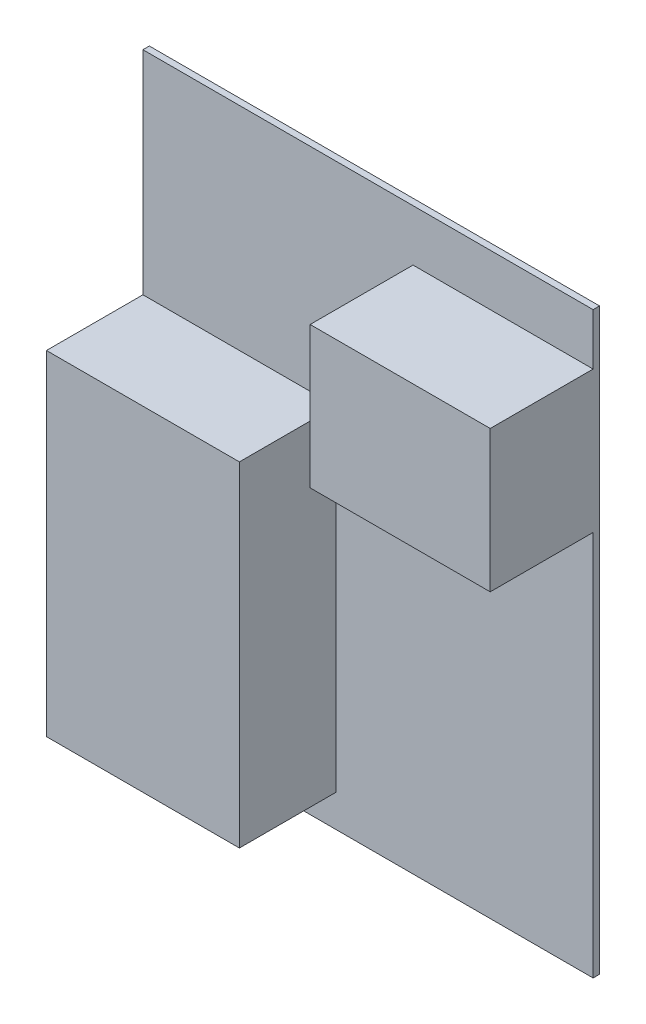
ISO-10303-21;
HEADER;
FILE_DESCRIPTION(('STEP AP214'),'2;1');
FILE_NAME('part.step','',(''),(''),'','','');
FILE_SCHEMA(('AUTOMOTIVE_DESIGN { 1 0 10303 214 1 1 1 1 }'));
ENDSEC;
DATA;
#1=APPLICATION_CONTEXT('core data for automotive mechanical design processes');
#2=APPLICATION_PROTOCOL_DEFINITION('international standard','automotive_design',2000,#1);
#3=PRODUCT_CONTEXT('',#1,'mechanical');
#4=PRODUCT('Part','Part','',(#3));
#5=PRODUCT_RELATED_PRODUCT_CATEGORY('part','',(#4));
#6=PRODUCT_DEFINITION_FORMATION('','',#4);
#7=PRODUCT_DEFINITION_CONTEXT('part definition',#1,'design');
#8=PRODUCT_DEFINITION('design','',#6,#7);
#9=PRODUCT_DEFINITION_SHAPE('','',#8);
#10=(LENGTH_UNIT() NAMED_UNIT(*) SI_UNIT(.MILLI.,.METRE.));
#11=(NAMED_UNIT(*) PLANE_ANGLE_UNIT() SI_UNIT($,.RADIAN.));
#12=(NAMED_UNIT(*) SI_UNIT($,.STERADIAN.) SOLID_ANGLE_UNIT());
#13=UNCERTAINTY_MEASURE_WITH_UNIT(LENGTH_MEASURE(1.E-05),#10,'distance_accuracy_value','');
#14=(GEOMETRIC_REPRESENTATION_CONTEXT(3) GLOBAL_UNCERTAINTY_ASSIGNED_CONTEXT((#13)) GLOBAL_UNIT_ASSIGNED_CONTEXT((#10,
#11,#12)) REPRESENTATION_CONTEXT('',''));
#15=CARTESIAN_POINT('',(0.,0.,0.));
#16=DIRECTION('',(0.,0.,1.));
#17=DIRECTION('',(1.,0.,0.));
#18=AXIS2_PLACEMENT_3D('',#15,#16,#17);
#19=CARTESIAN_POINT('',(0.,0.,1.));
#20=DIRECTION('',(0.,0.,-1.));
#21=DIRECTION('',(-1.,0.,0.));
#22=AXIS2_PLACEMENT_3D('',#19,#20,#21);
#23=PLANE('',#22);
#24=DIRECTION('',(1.,0.,0.));
#25=VECTOR('',#24,1.);
#26=CARTESIAN_POINT('',(-35.,-40.,1.));
#27=LINE('',#26,#25);
#28=CARTESIAN_POINT('',(-35.,-40.,1.));
#29=VERTEX_POINT('',#28);
#30=CARTESIAN_POINT('',(-5.,-40.,1.));
#31=VERTEX_POINT('',#30);
#32=EDGE_CURVE('E268',#29,#31,#27,.T.);
#33=ORIENTED_EDGE('',*,*,#32,.F.);
#34=DIRECTION('',(0.,-1.,0.));
#35=VECTOR('',#34,1.);
#36=CARTESIAN_POINT('',(-35.,-45.,1.));
#37=LINE('',#36,#35);
#38=CARTESIAN_POINT('',(-35.,-45.,1.));
#39=VERTEX_POINT('',#38);
#40=EDGE_CURVE('E152',#29,#39,#37,.T.);
#41=ORIENTED_EDGE('',*,*,#40,.T.);
#42=DIRECTION('',(1.,0.,0.));
#43=VECTOR('',#42,1.);
#44=CARTESIAN_POINT('',(-35.,-45.,1.));
#45=LINE('',#44,#43);
#46=CARTESIAN_POINT('',(35.,-45.,1.));
#47=VERTEX_POINT('',#46);
#48=EDGE_CURVE('E212',#39,#47,#45,.T.);
#49=ORIENTED_EDGE('',*,*,#48,.T.);
#50=DIRECTION('',(0.,1.,0.));
#51=VECTOR('',#50,1.);
#52=CARTESIAN_POINT('',(35.,-45.,1.));
#53=LINE('',#52,#51);
#54=CARTESIAN_POINT('',(35.,15.,1.));
#55=VERTEX_POINT('',#54);
#56=EDGE_CURVE('E202',#47,#55,#53,.T.);
#57=ORIENTED_EDGE('',*,*,#56,.T.);
#58=DIRECTION('',(1.,0.,0.));
#59=VECTOR('',#58,1.);
#60=CARTESIAN_POINT('',(35.,15.,1.));
#61=LINE('',#60,#59);
#62=CARTESIAN_POINT('',(7.00000000000002,15.,1.));
#63=VERTEX_POINT('',#62);
#64=EDGE_CURVE('E170',#63,#55,#61,.T.);
#65=ORIENTED_EDGE('',*,*,#64,.F.);
#66=DIRECTION('',(0.,-1.,0.));
#67=VECTOR('',#66,1.);
#68=CARTESIAN_POINT('',(7.00000000000001,37.,1.));
#69=LINE('',#68,#67);
#70=CARTESIAN_POINT('',(7.00000000000001,37.,1.));
#71=VERTEX_POINT('',#70);
#72=EDGE_CURVE('E159',#71,#63,#69,.T.);
#73=ORIENTED_EDGE('',*,*,#72,.F.);
#74=DIRECTION('',(-1.,0.,0.));
#75=VECTOR('',#74,1.);
#76=CARTESIAN_POINT('',(35.,37.,1.));
#77=LINE('',#76,#75);
#78=CARTESIAN_POINT('',(35.,37.,1.));
#79=VERTEX_POINT('',#78);
#80=EDGE_CURVE('E154',#79,#71,#77,.T.);
#81=ORIENTED_EDGE('',*,*,#80,.F.);
#82=CARTESIAN_POINT('',(35.,45.,1.));
#83=VERTEX_POINT('',#82);
#84=EDGE_CURVE('E206',#79,#83,#53,.T.);
#85=ORIENTED_EDGE('',*,*,#84,.T.);
#86=DIRECTION('',(-1.,0.,0.));
#87=VECTOR('',#86,1.);
#88=CARTESIAN_POINT('',(-35.,45.,1.));
#89=LINE('',#88,#87);
#90=CARTESIAN_POINT('',(-35.,45.,1.));
#91=VERTEX_POINT('',#90);
#92=EDGE_CURVE('E205',#83,#91,#89,.T.);
#93=ORIENTED_EDGE('',*,*,#92,.T.);
#94=CARTESIAN_POINT('',(-35.,12.,1.));
#95=VERTEX_POINT('',#94);
#96=EDGE_CURVE('E209',#91,#95,#37,.T.);
#97=ORIENTED_EDGE('',*,*,#96,.T.);
#98=DIRECTION('',(-1.,0.,0.));
#99=VECTOR('',#98,1.);
#100=CARTESIAN_POINT('',(-35.,12.,1.));
#101=LINE('',#100,#99);
#102=CARTESIAN_POINT('',(-5.,12.,1.));
#103=VERTEX_POINT('',#102);
#104=EDGE_CURVE('E60',#103,#95,#101,.T.);
#105=ORIENTED_EDGE('',*,*,#104,.F.);
#106=DIRECTION('',(0.,1.,0.));
#107=VECTOR('',#106,1.);
#108=CARTESIAN_POINT('',(-5.,-40.,1.));
#109=LINE('',#108,#107);
#110=EDGE_CURVE('E55',#31,#103,#109,.T.);
#111=ORIENTED_EDGE('',*,*,#110,.F.);
#112=EDGE_LOOP('',(#33,#41,#49,#57,#65,#73,#81,#85,#93,#97,#105,#111));
#113=FACE_BOUND('',#112,.T.);
#114=ADVANCED_FACE('F39',(#113),#23,.F.);
#115=CARTESIAN_POINT('',(35.,-45.,1.));
#116=DIRECTION('',(-1.,0.,0.));
#117=DIRECTION('',(0.,0.,1.));
#118=AXIS2_PLACEMENT_3D('',#115,#116,#117);
#119=PLANE('',#118);
#120=DIRECTION('',(0.,1.,0.));
#121=VECTOR('',#120,1.);
#122=CARTESIAN_POINT('',(35.,-45.,0.));
#123=LINE('',#122,#121);
#124=CARTESIAN_POINT('',(35.,-45.,0.));
#125=VERTEX_POINT('',#124);
#126=CARTESIAN_POINT('',(35.,45.,0.));
#127=VERTEX_POINT('',#126);
#128=EDGE_CURVE('E201',#125,#127,#123,.T.);
#129=ORIENTED_EDGE('',*,*,#128,.T.);
#130=DIRECTION('',(0.,0.,-1.));
#131=VECTOR('',#130,1.);
#132=CARTESIAN_POINT('',(35.,45.,1.));
#133=LINE('',#132,#131);
#134=EDGE_CURVE('E11',#83,#127,#133,.T.);
#135=ORIENTED_EDGE('',*,*,#134,.F.);
#136=ORIENTED_EDGE('',*,*,#84,.F.);
#137=DIRECTION('',(0.,0.,-1.));
#138=VECTOR('',#137,1.);
#139=CARTESIAN_POINT('',(35.,37.,17.));
#140=LINE('',#139,#138);
#141=CARTESIAN_POINT('',(35.,37.,17.));
#142=VERTEX_POINT('',#141);
#143=EDGE_CURVE('E197',#142,#79,#140,.T.);
#144=ORIENTED_EDGE('',*,*,#143,.F.);
#145=DIRECTION('',(0.,1.,0.));
#146=VECTOR('',#145,1.);
#147=CARTESIAN_POINT('',(35.,37.,17.));
#148=LINE('',#147,#146);
#149=CARTESIAN_POINT('',(35.,15.,17.));
#150=VERTEX_POINT('',#149);
#151=EDGE_CURVE('E165',#150,#142,#148,.T.);
#152=ORIENTED_EDGE('',*,*,#151,.F.);
#153=DIRECTION('',(0.,0.,-1.));
#154=VECTOR('',#153,1.);
#155=CARTESIAN_POINT('',(35.,15.,17.));
#156=LINE('',#155,#154);
#157=EDGE_CURVE('E178',#150,#55,#156,.T.);
#158=ORIENTED_EDGE('',*,*,#157,.T.);
#159=ORIENTED_EDGE('',*,*,#56,.F.);
#160=DIRECTION('',(0.,0.,-1.));
#161=VECTOR('',#160,1.);
#162=CARTESIAN_POINT('',(35.,-45.,1.));
#163=LINE('',#162,#161);
#164=EDGE_CURVE('E215',#47,#125,#163,.T.);
#165=ORIENTED_EDGE('',*,*,#164,.T.);
#166=EDGE_LOOP('',(#129,#135,#136,#144,#152,#158,#159,#165));
#167=FACE_BOUND('',#166,.T.);
#168=ADVANCED_FACE('F41',(#167),#119,.F.);
#169=CARTESIAN_POINT('',(-35.,45.,1.));
#170=DIRECTION('',(0.,-1.,0.));
#171=DIRECTION('',(0.,0.,-1.));
#172=AXIS2_PLACEMENT_3D('',#169,#170,#171);
#173=PLANE('',#172);
#174=DIRECTION('',(-1.,0.,0.));
#175=VECTOR('',#174,1.);
#176=CARTESIAN_POINT('',(-35.,45.,0.));
#177=LINE('',#176,#175);
#178=CARTESIAN_POINT('',(-35.,45.,0.));
#179=VERTEX_POINT('',#178);
#180=EDGE_CURVE('E219',#127,#179,#177,.T.);
#181=ORIENTED_EDGE('',*,*,#180,.T.);
#182=DIRECTION('',(0.,0.,-1.));
#183=VECTOR('',#182,1.);
#184=CARTESIAN_POINT('',(-35.,45.,1.));
#185=LINE('',#184,#183);
#186=EDGE_CURVE('E48',#91,#179,#185,.T.);
#187=ORIENTED_EDGE('',*,*,#186,.F.);
#188=ORIENTED_EDGE('',*,*,#92,.F.);
#189=ORIENTED_EDGE('',*,*,#134,.T.);
#190=EDGE_LOOP('',(#181,#187,#188,#189));
#191=FACE_BOUND('',#190,.T.);
#192=ADVANCED_FACE('F303',(#191),#173,.F.);
#193=CARTESIAN_POINT('',(-35.,-45.,1.));
#194=DIRECTION('',(1.,0.,0.));
#195=DIRECTION('',(0.,0.,-1.));
#196=AXIS2_PLACEMENT_3D('',#193,#194,#195);
#197=PLANE('',#196);
#198=DIRECTION('',(0.,-1.,0.));
#199=VECTOR('',#198,1.);
#200=CARTESIAN_POINT('',(-35.,-45.,0.));
#201=LINE('',#200,#199);
#202=CARTESIAN_POINT('',(-35.,-45.,0.));
#203=VERTEX_POINT('',#202);
#204=EDGE_CURVE('E222',#179,#203,#201,.T.);
#205=ORIENTED_EDGE('',*,*,#204,.T.);
#206=DIRECTION('',(0.,0.,-1.));
#207=VECTOR('',#206,1.);
#208=CARTESIAN_POINT('',(-35.,-45.,1.));
#209=LINE('',#208,#207);
#210=EDGE_CURVE('E231',#39,#203,#209,.T.);
#211=ORIENTED_EDGE('',*,*,#210,.F.);
#212=ORIENTED_EDGE('',*,*,#40,.F.);
#213=DIRECTION('',(0.,0.,-1.));
#214=VECTOR('',#213,1.);
#215=CARTESIAN_POINT('',(-35.,-40.,16.));
#216=LINE('',#215,#214);
#217=CARTESIAN_POINT('',(-35.,-40.,16.));
#218=VERTEX_POINT('',#217);
#219=EDGE_CURVE('E132',#218,#29,#216,.T.);
#220=ORIENTED_EDGE('',*,*,#219,.F.);
#221=DIRECTION('',(0.,-1.,0.));
#222=VECTOR('',#221,1.);
#223=CARTESIAN_POINT('',(-35.,-40.,16.));
#224=LINE('',#223,#222);
#225=CARTESIAN_POINT('',(-35.,12.,16.));
#226=VERTEX_POINT('',#225);
#227=EDGE_CURVE('E139',#226,#218,#224,.T.);
#228=ORIENTED_EDGE('',*,*,#227,.F.);
#229=DIRECTION('',(0.,0.,-1.));
#230=VECTOR('',#229,1.);
#231=CARTESIAN_POINT('',(-35.,12.,16.));
#232=LINE('',#231,#230);
#233=EDGE_CURVE('E278',#226,#95,#232,.T.);
#234=ORIENTED_EDGE('',*,*,#233,.T.);
#235=ORIENTED_EDGE('',*,*,#96,.F.);
#236=ORIENTED_EDGE('',*,*,#186,.T.);
#237=EDGE_LOOP('',(#205,#211,#212,#220,#228,#234,#235,#236));
#238=FACE_BOUND('',#237,.T.);
#239=ADVANCED_FACE('F150',(#238),#197,.F.);
#240=CARTESIAN_POINT('',(-35.,-45.,1.));
#241=DIRECTION('',(0.,1.,0.));
#242=DIRECTION('',(0.,0.,1.));
#243=AXIS2_PLACEMENT_3D('',#240,#241,#242);
#244=PLANE('',#243);
#245=DIRECTION('',(1.,0.,0.));
#246=VECTOR('',#245,1.);
#247=CARTESIAN_POINT('',(-35.,-45.,0.));
#248=LINE('',#247,#246);
#249=EDGE_CURVE('E225',#203,#125,#248,.T.);
#250=ORIENTED_EDGE('',*,*,#249,.T.);
#251=ORIENTED_EDGE('',*,*,#164,.F.);
#252=ORIENTED_EDGE('',*,*,#48,.F.);
#253=ORIENTED_EDGE('',*,*,#210,.T.);
#254=EDGE_LOOP('',(#250,#251,#252,#253));
#255=FACE_BOUND('',#254,.T.);
#256=ADVANCED_FACE('F247',(#255),#244,.F.);
#257=CARTESIAN_POINT('',(0.,0.,0.));
#258=DIRECTION('',(0.,0.,-1.));
#259=DIRECTION('',(-1.,0.,0.));
#260=AXIS2_PLACEMENT_3D('',#257,#258,#259);
#261=PLANE('',#260);
#262=ORIENTED_EDGE('',*,*,#128,.F.);
#263=ORIENTED_EDGE('',*,*,#249,.F.);
#264=ORIENTED_EDGE('',*,*,#204,.F.);
#265=ORIENTED_EDGE('',*,*,#180,.F.);
#266=EDGE_LOOP('',(#262,#263,#264,#265));
#267=FACE_BOUND('',#266,.T.);
#268=ADVANCED_FACE('F244',(#267),#261,.T.);
#269=CARTESIAN_POINT('',(35.,37.,17.));
#270=DIRECTION('',(0.,-1.,0.));
#271=DIRECTION('',(1.,0.,0.));
#272=AXIS2_PLACEMENT_3D('',#269,#270,#271);
#273=PLANE('',#272);
#274=ORIENTED_EDGE('',*,*,#80,.T.);
#275=DIRECTION('',(0.,0.,-1.));
#276=VECTOR('',#275,1.);
#277=CARTESIAN_POINT('',(7.00000000000001,37.,17.));
#278=LINE('',#277,#276);
#279=CARTESIAN_POINT('',(7.00000000000001,37.,17.));
#280=VERTEX_POINT('',#279);
#281=EDGE_CURVE('E193',#280,#71,#278,.T.);
#282=ORIENTED_EDGE('',*,*,#281,.F.);
#283=DIRECTION('',(-1.,0.,0.));
#284=VECTOR('',#283,1.);
#285=CARTESIAN_POINT('',(35.,37.,17.));
#286=LINE('',#285,#284);
#287=EDGE_CURVE('E169',#142,#280,#286,.T.);
#288=ORIENTED_EDGE('',*,*,#287,.F.);
#289=ORIENTED_EDGE('',*,*,#143,.T.);
#290=EDGE_LOOP('',(#274,#282,#288,#289));
#291=FACE_BOUND('',#290,.T.);
#292=ADVANCED_FACE('F264',(#291),#273,.F.);
#293=CARTESIAN_POINT('',(7.00000000000001,37.,17.));
#294=DIRECTION('',(1.,0.,0.));
#295=DIRECTION('',(0.,1.,0.));
#296=AXIS2_PLACEMENT_3D('',#293,#294,#295);
#297=PLANE('',#296);
#298=ORIENTED_EDGE('',*,*,#72,.T.);
#299=DIRECTION('',(0.,0.,-1.));
#300=VECTOR('',#299,1.);
#301=CARTESIAN_POINT('',(7.00000000000002,15.,17.));
#302=LINE('',#301,#300);
#303=CARTESIAN_POINT('',(7.00000000000002,15.,17.));
#304=VERTEX_POINT('',#303);
#305=EDGE_CURVE('E189',#304,#63,#302,.T.);
#306=ORIENTED_EDGE('',*,*,#305,.F.);
#307=DIRECTION('',(0.,-1.,0.));
#308=VECTOR('',#307,1.);
#309=CARTESIAN_POINT('',(7.00000000000001,37.,17.));
#310=LINE('',#309,#308);
#311=EDGE_CURVE('E173',#280,#304,#310,.T.);
#312=ORIENTED_EDGE('',*,*,#311,.F.);
#313=ORIENTED_EDGE('',*,*,#281,.T.);
#314=EDGE_LOOP('',(#298,#306,#312,#313));
#315=FACE_BOUND('',#314,.T.);
#316=ADVANCED_FACE('F260',(#315),#297,.F.);
#317=CARTESIAN_POINT('',(35.,15.,17.));
#318=DIRECTION('',(0.,1.,0.));
#319=DIRECTION('',(-1.,0.,0.));
#320=AXIS2_PLACEMENT_3D('',#317,#318,#319);
#321=PLANE('',#320);
#322=ORIENTED_EDGE('',*,*,#64,.T.);
#323=ORIENTED_EDGE('',*,*,#157,.F.);
#324=DIRECTION('',(1.,0.,0.));
#325=VECTOR('',#324,1.);
#326=CARTESIAN_POINT('',(35.,15.,17.));
#327=LINE('',#326,#325);
#328=EDGE_CURVE('E176',#304,#150,#327,.T.);
#329=ORIENTED_EDGE('',*,*,#328,.F.);
#330=ORIENTED_EDGE('',*,*,#305,.T.);
#331=EDGE_LOOP('',(#322,#323,#329,#330));
#332=FACE_BOUND('',#331,.T.);
#333=ADVANCED_FACE('F255',(#332),#321,.F.);
#334=CARTESIAN_POINT('',(0.,0.,17.));
#335=DIRECTION('',(0.,0.,-1.));
#336=DIRECTION('',(-1.,0.,0.));
#337=AXIS2_PLACEMENT_3D('',#334,#335,#336);
#338=PLANE('',#337);
#339=ORIENTED_EDGE('',*,*,#151,.T.);
#340=ORIENTED_EDGE('',*,*,#287,.T.);
#341=ORIENTED_EDGE('',*,*,#311,.T.);
#342=ORIENTED_EDGE('',*,*,#328,.T.);
#343=EDGE_LOOP('',(#339,#340,#341,#342));
#344=FACE_BOUND('',#343,.T.);
#345=ADVANCED_FACE('F296',(#344),#338,.F.);
#346=CARTESIAN_POINT('',(-35.,-40.,16.));
#347=DIRECTION('',(0.,1.,0.));
#348=DIRECTION('',(-1.,0.,0.));
#349=AXIS2_PLACEMENT_3D('',#346,#347,#348);
#350=PLANE('',#349);
#351=ORIENTED_EDGE('',*,*,#32,.T.);
#352=DIRECTION('',(0.,0.,-1.));
#353=VECTOR('',#352,1.);
#354=CARTESIAN_POINT('',(-5.,-40.,16.));
#355=LINE('',#354,#353);
#356=CARTESIAN_POINT('',(-5.,-40.,16.));
#357=VERTEX_POINT('',#356);
#358=EDGE_CURVE('E134',#357,#31,#355,.T.);
#359=ORIENTED_EDGE('',*,*,#358,.F.);
#360=DIRECTION('',(1.,0.,0.));
#361=VECTOR('',#360,1.);
#362=CARTESIAN_POINT('',(-35.,-40.,16.));
#363=LINE('',#362,#361);
#364=EDGE_CURVE('E128',#218,#357,#363,.T.);
#365=ORIENTED_EDGE('',*,*,#364,.F.);
#366=ORIENTED_EDGE('',*,*,#219,.T.);
#367=EDGE_LOOP('',(#351,#359,#365,#366));
#368=FACE_BOUND('',#367,.T.);
#369=ADVANCED_FACE('F130',(#368),#350,.F.);
#370=CARTESIAN_POINT('',(-5.,-40.,16.));
#371=DIRECTION('',(-1.,0.,0.));
#372=DIRECTION('',(0.,0.,1.));
#373=AXIS2_PLACEMENT_3D('',#370,#371,#372);
#374=PLANE('',#373);
#375=ORIENTED_EDGE('',*,*,#110,.T.);
#376=DIRECTION('',(0.,0.,-1.));
#377=VECTOR('',#376,1.);
#378=CARTESIAN_POINT('',(-5.,12.,16.));
#379=LINE('',#378,#377);
#380=CARTESIAN_POINT('',(-5.,12.,16.));
#381=VERTEX_POINT('',#380);
#382=EDGE_CURVE('E161',#381,#103,#379,.T.);
#383=ORIENTED_EDGE('',*,*,#382,.F.);
#384=DIRECTION('',(0.,1.,0.));
#385=VECTOR('',#384,1.);
#386=CARTESIAN_POINT('',(-5.,-40.,16.));
#387=LINE('',#386,#385);
#388=EDGE_CURVE('E138',#357,#381,#387,.T.);
#389=ORIENTED_EDGE('',*,*,#388,.F.);
#390=ORIENTED_EDGE('',*,*,#358,.T.);
#391=EDGE_LOOP('',(#375,#383,#389,#390));
#392=FACE_BOUND('',#391,.T.);
#393=ADVANCED_FACE('F286',(#392),#374,.F.);
#394=CARTESIAN_POINT('',(-35.,12.,16.));
#395=DIRECTION('',(0.,-1.,0.));
#396=DIRECTION('',(0.,0.,-1.));
#397=AXIS2_PLACEMENT_3D('',#394,#395,#396);
#398=PLANE('',#397);
#399=ORIENTED_EDGE('',*,*,#104,.T.);
#400=ORIENTED_EDGE('',*,*,#233,.F.);
#401=DIRECTION('',(-1.,0.,0.));
#402=VECTOR('',#401,1.);
#403=CARTESIAN_POINT('',(-35.,12.,16.));
#404=LINE('',#403,#402);
#405=EDGE_CURVE('E144',#381,#226,#404,.T.);
#406=ORIENTED_EDGE('',*,*,#405,.F.);
#407=ORIENTED_EDGE('',*,*,#382,.T.);
#408=EDGE_LOOP('',(#399,#400,#406,#407));
#409=FACE_BOUND('',#408,.T.);
#410=ADVANCED_FACE('F284',(#409),#398,.F.);
#411=CARTESIAN_POINT('',(0.,0.,16.));
#412=DIRECTION('',(0.,0.,-1.));
#413=DIRECTION('',(-1.,0.,0.));
#414=AXIS2_PLACEMENT_3D('',#411,#412,#413);
#415=PLANE('',#414);
#416=ORIENTED_EDGE('',*,*,#227,.T.);
#417=ORIENTED_EDGE('',*,*,#364,.T.);
#418=ORIENTED_EDGE('',*,*,#388,.T.);
#419=ORIENTED_EDGE('',*,*,#405,.T.);
#420=EDGE_LOOP('',(#416,#417,#418,#419));
#421=FACE_BOUND('',#420,.T.);
#422=ADVANCED_FACE('F142',(#421),#415,.F.);
#423=CLOSED_SHELL('',(#114,#168,#192,#239,#256,#268,#292,#316,#333,#345,#369,#393,#410,#422));
#424=MANIFOLD_SOLID_BREP('B2',#423);
#425=ADVANCED_BREP_SHAPE_REPRESENTATION('',(#18,#424),#14);
#426=SHAPE_DEFINITION_REPRESENTATION(#9,#425);
ENDSEC;
END-ISO-10303-21;
